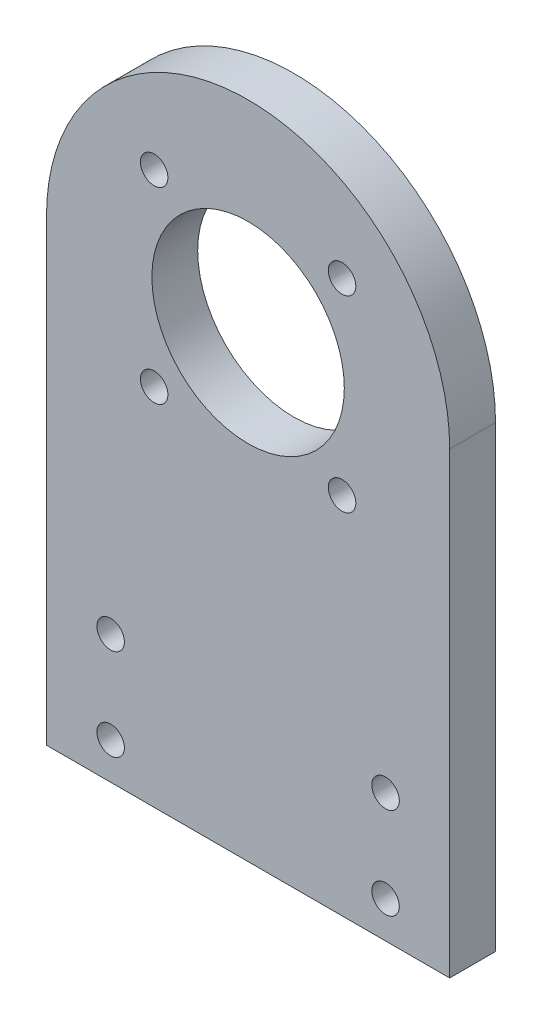
ISO-10303-21;
HEADER;
FILE_DESCRIPTION(('STEP AP214'),'2;1');
FILE_NAME('part.step','',(''),(''),'','','');
FILE_SCHEMA(('AUTOMOTIVE_DESIGN { 1 0 10303 214 1 1 1 1 }'));
ENDSEC;
DATA;
#1=APPLICATION_CONTEXT('core data for automotive mechanical design processes');
#2=APPLICATION_PROTOCOL_DEFINITION('international standard','automotive_design',2000,#1);
#3=PRODUCT_CONTEXT('',#1,'mechanical');
#4=PRODUCT('Part','Part','',(#3));
#5=PRODUCT_RELATED_PRODUCT_CATEGORY('part','',(#4));
#6=PRODUCT_DEFINITION_FORMATION('','',#4);
#7=PRODUCT_DEFINITION_CONTEXT('part definition',#1,'design');
#8=PRODUCT_DEFINITION('design','',#6,#7);
#9=PRODUCT_DEFINITION_SHAPE('','',#8);
#10=(LENGTH_UNIT() NAMED_UNIT(*) SI_UNIT(.MILLI.,.METRE.));
#11=(NAMED_UNIT(*) PLANE_ANGLE_UNIT() SI_UNIT($,.RADIAN.));
#12=(NAMED_UNIT(*) SI_UNIT($,.STERADIAN.) SOLID_ANGLE_UNIT());
#13=UNCERTAINTY_MEASURE_WITH_UNIT(LENGTH_MEASURE(1.E-05),#10,'distance_accuracy_value','');
#14=(GEOMETRIC_REPRESENTATION_CONTEXT(3) GLOBAL_UNCERTAINTY_ASSIGNED_CONTEXT((#13)) GLOBAL_UNIT_ASSIGNED_CONTEXT((#10,
#11,#12)) REPRESENTATION_CONTEXT('',''));
#15=CARTESIAN_POINT('',(0.,0.,0.));
#16=DIRECTION('',(0.,0.,1.));
#17=DIRECTION('',(1.,0.,0.));
#18=AXIS2_PLACEMENT_3D('',#15,#16,#17);
#19=CARTESIAN_POINT('',(1.17961196366423E-13,50.,5.));
#20=DIRECTION('',(0.,0.,1.));
#21=DIRECTION('',(1.,0.,0.));
#22=AXIS2_PLACEMENT_3D('',#19,#20,#21);
#23=PLANE('',#22);
#24=CARTESIAN_POINT('',(-10.2530483272048,39.7469516727951,5.));
#25=DIRECTION('',(0.,0.,-1.));
#26=DIRECTION('',(-1.,0.,0.));
#27=AXIS2_PLACEMENT_3D('',#24,#25,#26);
#28=CIRCLE('',#27,1.5);
#29=CARTESIAN_POINT('',(-11.7530483272048,39.7469516727951,5.));
#30=VERTEX_POINT('',#29);
#31=EDGE_CURVE('E151',#30,#30,#28,.T.);
#32=ORIENTED_EDGE('',*,*,#31,.T.);
#33=EDGE_LOOP('',(#32));
#34=FACE_BOUND('',#33,.T.);
#35=CARTESIAN_POINT('',(10.253048327205,39.7469516727951,5.));
#36=DIRECTION('',(0.,0.,-1.));
#37=DIRECTION('',(-1.,0.,0.));
#38=AXIS2_PLACEMENT_3D('',#35,#36,#37);
#39=CIRCLE('',#38,1.5);
#40=CARTESIAN_POINT('',(8.75304832720504,39.7469516727951,5.));
#41=VERTEX_POINT('',#40);
#42=EDGE_CURVE('E163',#41,#41,#39,.T.);
#43=ORIENTED_EDGE('',*,*,#42,.T.);
#44=EDGE_LOOP('',(#43));
#45=FACE_BOUND('',#44,.T.);
#46=CARTESIAN_POINT('',(10.2530483272051,60.2530483272049,5.));
#47=DIRECTION('',(0.,0.,-1.));
#48=DIRECTION('',(-1.,0.,0.));
#49=AXIS2_PLACEMENT_3D('',#46,#47,#48);
#50=CIRCLE('',#49,1.50000000000001);
#51=CARTESIAN_POINT('',(8.75304832720507,60.2530483272049,5.));
#52=VERTEX_POINT('',#51);
#53=EDGE_CURVE('E157',#52,#52,#50,.T.);
#54=ORIENTED_EDGE('',*,*,#53,.T.);
#55=EDGE_LOOP('',(#54));
#56=FACE_BOUND('',#55,.T.);
#57=CARTESIAN_POINT('',(-10.2530483272048,60.253048327205,5.));
#58=DIRECTION('',(0.,0.,-1.));
#59=DIRECTION('',(-1.,0.,0.));
#60=AXIS2_PLACEMENT_3D('',#57,#58,#59);
#61=CIRCLE('',#60,1.5);
#62=CARTESIAN_POINT('',(-11.7530483272048,60.253048327205,5.));
#63=VERTEX_POINT('',#62);
#64=EDGE_CURVE('E145',#63,#63,#61,.T.);
#65=ORIENTED_EDGE('',*,*,#64,.T.);
#66=EDGE_LOOP('',(#65));
#67=FACE_BOUND('',#66,.T.);
#68=CARTESIAN_POINT('',(15.,14.,5.));
#69=DIRECTION('',(0.,0.,1.));
#70=DIRECTION('',(-1.,0.,0.));
#71=AXIS2_PLACEMENT_3D('',#68,#69,#70);
#72=CIRCLE('',#71,1.5);
#73=CARTESIAN_POINT('',(13.5,14.,5.));
#74=VERTEX_POINT('',#73);
#75=EDGE_CURVE('E133',#74,#74,#72,.T.);
#76=ORIENTED_EDGE('',*,*,#75,.F.);
#77=EDGE_LOOP('',(#76));
#78=FACE_BOUND('',#77,.T.);
#79=CARTESIAN_POINT('',(-15.,4.,5.));
#80=DIRECTION('',(0.,0.,1.));
#81=DIRECTION('',(1.,0.,0.));
#82=AXIS2_PLACEMENT_3D('',#79,#80,#81);
#83=CIRCLE('',#82,1.5);
#84=CARTESIAN_POINT('',(-13.5,4.,5.));
#85=VERTEX_POINT('',#84);
#86=EDGE_CURVE('E121',#85,#85,#83,.T.);
#87=ORIENTED_EDGE('',*,*,#86,.F.);
#88=EDGE_LOOP('',(#87));
#89=FACE_BOUND('',#88,.T.);
#90=DIRECTION('',(0.,-1.,0.));
#91=VECTOR('',#90,1.);
#92=CARTESIAN_POINT('',(-22.,0.,5.));
#93=LINE('',#92,#91);
#94=CARTESIAN_POINT('',(-21.9999999999999,50.,5.));
#95=VERTEX_POINT('',#94);
#96=CARTESIAN_POINT('',(-22.,0.,5.));
#97=VERTEX_POINT('',#96);
#98=EDGE_CURVE('E91',#95,#97,#93,.T.);
#99=ORIENTED_EDGE('',*,*,#98,.T.);
#100=DIRECTION('',(1.,0.,0.));
#101=VECTOR('',#100,1.);
#102=CARTESIAN_POINT('',(-22.,0.,5.));
#103=LINE('',#102,#101);
#104=CARTESIAN_POINT('',(22.,0.,5.));
#105=VERTEX_POINT('',#104);
#106=EDGE_CURVE('E86',#97,#105,#103,.T.);
#107=ORIENTED_EDGE('',*,*,#106,.T.);
#108=DIRECTION('',(0.,1.,0.));
#109=VECTOR('',#108,1.);
#110=CARTESIAN_POINT('',(22.,0.,5.));
#111=LINE('',#110,#109);
#112=CARTESIAN_POINT('',(22.,50.,5.));
#113=VERTEX_POINT('',#112);
#114=EDGE_CURVE('E89',#105,#113,#111,.T.);
#115=ORIENTED_EDGE('',*,*,#114,.T.);
#116=CARTESIAN_POINT('',(1.17961196366423E-13,50.,5.));
#117=DIRECTION('',(0.,0.,1.));
#118=DIRECTION('',(1.,0.,0.));
#119=AXIS2_PLACEMENT_3D('',#116,#117,#118);
#120=CIRCLE('',#119,22.);
#121=EDGE_CURVE('E56',#113,#95,#120,.T.);
#122=ORIENTED_EDGE('',*,*,#121,.T.);
#123=EDGE_LOOP('',(#99,#107,#115,#122));
#124=FACE_BOUND('',#123,.T.);
#125=CARTESIAN_POINT('',(-15.,14.,5.));
#126=DIRECTION('',(0.,0.,1.));
#127=DIRECTION('',(1.,0.,0.));
#128=AXIS2_PLACEMENT_3D('',#125,#126,#127);
#129=CIRCLE('',#128,1.5);
#130=CARTESIAN_POINT('',(-13.5,14.,5.));
#131=VERTEX_POINT('',#130);
#132=EDGE_CURVE('E106',#131,#131,#129,.T.);
#133=ORIENTED_EDGE('',*,*,#132,.F.);
#134=EDGE_LOOP('',(#133));
#135=FACE_BOUND('',#134,.T.);
#136=CARTESIAN_POINT('',(15.,4.,5.));
#137=DIRECTION('',(0.,0.,1.));
#138=DIRECTION('',(-1.,0.,0.));
#139=AXIS2_PLACEMENT_3D('',#136,#137,#138);
#140=CIRCLE('',#139,1.5);
#141=CARTESIAN_POINT('',(13.5,4.,5.));
#142=VERTEX_POINT('',#141);
#143=EDGE_CURVE('E127',#142,#142,#140,.T.);
#144=ORIENTED_EDGE('',*,*,#143,.F.);
#145=EDGE_LOOP('',(#144));
#146=FACE_BOUND('',#145,.T.);
#147=CARTESIAN_POINT('',(1.17961196366423E-13,50.,5.));
#148=DIRECTION('',(0.,0.,1.));
#149=DIRECTION('',(1.,0.,0.));
#150=AXIS2_PLACEMENT_3D('',#147,#148,#149);
#151=CIRCLE('',#150,10.5);
#152=CARTESIAN_POINT('',(10.5000000000001,50.,5.));
#153=VERTEX_POINT('',#152);
#154=EDGE_CURVE('E139',#153,#153,#151,.T.);
#155=ORIENTED_EDGE('',*,*,#154,.F.);
#156=EDGE_LOOP('',(#155));
#157=FACE_BOUND('',#156,.T.);
#158=ADVANCED_FACE('F39',(#34,#45,#56,#67,#78,#89,#124,#135,#146,#157),#23,.T.);
#159=CARTESIAN_POINT('',(1.17961196366423E-13,50.,0.));
#160=DIRECTION('',(0.,0.,1.));
#161=DIRECTION('',(1.,0.,0.));
#162=AXIS2_PLACEMENT_3D('',#159,#160,#161);
#163=PLANE('',#162);
#164=CARTESIAN_POINT('',(-10.2530483272048,39.7469516727951,0.));
#165=DIRECTION('',(0.,0.,-1.));
#166=DIRECTION('',(-1.,0.,0.));
#167=AXIS2_PLACEMENT_3D('',#164,#165,#166);
#168=CIRCLE('',#167,1.5);
#169=CARTESIAN_POINT('',(-11.7530483272048,39.7469516727951,0.));
#170=VERTEX_POINT('',#169);
#171=EDGE_CURVE('E166',#170,#170,#168,.T.);
#172=ORIENTED_EDGE('',*,*,#171,.F.);
#173=EDGE_LOOP('',(#172));
#174=FACE_BOUND('',#173,.T.);
#175=CARTESIAN_POINT('',(10.253048327205,39.7469516727951,0.));
#176=DIRECTION('',(0.,0.,-1.));
#177=DIRECTION('',(-1.,0.,0.));
#178=AXIS2_PLACEMENT_3D('',#175,#176,#177);
#179=CIRCLE('',#178,1.5);
#180=CARTESIAN_POINT('',(8.75304832720504,39.7469516727951,0.));
#181=VERTEX_POINT('',#180);
#182=EDGE_CURVE('E160',#181,#181,#179,.T.);
#183=ORIENTED_EDGE('',*,*,#182,.F.);
#184=EDGE_LOOP('',(#183));
#185=FACE_BOUND('',#184,.T.);
#186=CARTESIAN_POINT('',(10.2530483272051,60.2530483272049,0.));
#187=DIRECTION('',(0.,0.,-1.));
#188=DIRECTION('',(-1.,0.,0.));
#189=AXIS2_PLACEMENT_3D('',#186,#187,#188);
#190=CIRCLE('',#189,1.50000000000001);
#191=CARTESIAN_POINT('',(8.75304832720507,60.2530483272049,0.));
#192=VERTEX_POINT('',#191);
#193=EDGE_CURVE('E154',#192,#192,#190,.T.);
#194=ORIENTED_EDGE('',*,*,#193,.F.);
#195=EDGE_LOOP('',(#194));
#196=FACE_BOUND('',#195,.T.);
#197=CARTESIAN_POINT('',(-10.2530483272048,60.253048327205,0.));
#198=DIRECTION('',(0.,0.,-1.));
#199=DIRECTION('',(-1.,0.,0.));
#200=AXIS2_PLACEMENT_3D('',#197,#198,#199);
#201=CIRCLE('',#200,1.5);
#202=CARTESIAN_POINT('',(-11.7530483272048,60.253048327205,0.));
#203=VERTEX_POINT('',#202);
#204=EDGE_CURVE('E148',#203,#203,#201,.T.);
#205=ORIENTED_EDGE('',*,*,#204,.F.);
#206=EDGE_LOOP('',(#205));
#207=FACE_BOUND('',#206,.T.);
#208=DIRECTION('',(0.,-1.,0.));
#209=VECTOR('',#208,1.);
#210=CARTESIAN_POINT('',(-22.,0.,0.));
#211=LINE('',#210,#209);
#212=CARTESIAN_POINT('',(-21.9999999999999,50.,0.));
#213=VERTEX_POINT('',#212);
#214=CARTESIAN_POINT('',(-22.,0.,0.));
#215=VERTEX_POINT('',#214);
#216=EDGE_CURVE('E103',#213,#215,#211,.T.);
#217=ORIENTED_EDGE('',*,*,#216,.F.);
#218=CARTESIAN_POINT('',(1.17961196366423E-13,50.,0.));
#219=DIRECTION('',(0.,0.,1.));
#220=DIRECTION('',(1.,0.,0.));
#221=AXIS2_PLACEMENT_3D('',#218,#219,#220);
#222=CIRCLE('',#221,22.);
#223=CARTESIAN_POINT('',(22.,50.,0.));
#224=VERTEX_POINT('',#223);
#225=EDGE_CURVE('E79',#224,#213,#222,.T.);
#226=ORIENTED_EDGE('',*,*,#225,.F.);
#227=DIRECTION('',(0.,1.,0.));
#228=VECTOR('',#227,1.);
#229=CARTESIAN_POINT('',(22.,0.,0.));
#230=LINE('',#229,#228);
#231=CARTESIAN_POINT('',(22.,0.,0.));
#232=VERTEX_POINT('',#231);
#233=EDGE_CURVE('E73',#232,#224,#230,.T.);
#234=ORIENTED_EDGE('',*,*,#233,.F.);
#235=DIRECTION('',(1.,0.,0.));
#236=VECTOR('',#235,1.);
#237=CARTESIAN_POINT('',(-22.,0.,0.));
#238=LINE('',#237,#236);
#239=EDGE_CURVE('E95',#215,#232,#238,.T.);
#240=ORIENTED_EDGE('',*,*,#239,.F.);
#241=EDGE_LOOP('',(#217,#226,#234,#240));
#242=FACE_BOUND('',#241,.T.);
#243=CARTESIAN_POINT('',(-15.,14.,0.));
#244=DIRECTION('',(0.,0.,1.));
#245=DIRECTION('',(1.,0.,0.));
#246=AXIS2_PLACEMENT_3D('',#243,#244,#245);
#247=CIRCLE('',#246,1.5);
#248=CARTESIAN_POINT('',(-13.5,14.,0.));
#249=VERTEX_POINT('',#248);
#250=EDGE_CURVE('E118',#249,#249,#247,.T.);
#251=ORIENTED_EDGE('',*,*,#250,.T.);
#252=EDGE_LOOP('',(#251));
#253=FACE_BOUND('',#252,.T.);
#254=CARTESIAN_POINT('',(-15.,4.,0.));
#255=DIRECTION('',(0.,0.,1.));
#256=DIRECTION('',(1.,0.,0.));
#257=AXIS2_PLACEMENT_3D('',#254,#255,#256);
#258=CIRCLE('',#257,1.5);
#259=CARTESIAN_POINT('',(-13.5,4.,0.));
#260=VERTEX_POINT('',#259);
#261=EDGE_CURVE('E124',#260,#260,#258,.T.);
#262=ORIENTED_EDGE('',*,*,#261,.T.);
#263=EDGE_LOOP('',(#262));
#264=FACE_BOUND('',#263,.T.);
#265=CARTESIAN_POINT('',(15.,4.,0.));
#266=DIRECTION('',(0.,0.,1.));
#267=DIRECTION('',(-1.,0.,0.));
#268=AXIS2_PLACEMENT_3D('',#265,#266,#267);
#269=CIRCLE('',#268,1.5);
#270=CARTESIAN_POINT('',(13.5,4.,0.));
#271=VERTEX_POINT('',#270);
#272=EDGE_CURVE('E130',#271,#271,#269,.T.);
#273=ORIENTED_EDGE('',*,*,#272,.T.);
#274=EDGE_LOOP('',(#273));
#275=FACE_BOUND('',#274,.T.);
#276=CARTESIAN_POINT('',(15.,14.,0.));
#277=DIRECTION('',(0.,0.,1.));
#278=DIRECTION('',(-1.,0.,0.));
#279=AXIS2_PLACEMENT_3D('',#276,#277,#278);
#280=CIRCLE('',#279,1.5);
#281=CARTESIAN_POINT('',(13.5,14.,0.));
#282=VERTEX_POINT('',#281);
#283=EDGE_CURVE('E136',#282,#282,#280,.T.);
#284=ORIENTED_EDGE('',*,*,#283,.T.);
#285=EDGE_LOOP('',(#284));
#286=FACE_BOUND('',#285,.T.);
#287=CARTESIAN_POINT('',(1.17961196366423E-13,50.,0.));
#288=DIRECTION('',(0.,0.,1.));
#289=DIRECTION('',(1.,0.,0.));
#290=AXIS2_PLACEMENT_3D('',#287,#288,#289);
#291=CIRCLE('',#290,10.5);
#292=CARTESIAN_POINT('',(10.5000000000001,50.,0.));
#293=VERTEX_POINT('',#292);
#294=EDGE_CURVE('E142',#293,#293,#291,.T.);
#295=ORIENTED_EDGE('',*,*,#294,.T.);
#296=EDGE_LOOP('',(#295));
#297=FACE_BOUND('',#296,.T.);
#298=ADVANCED_FACE('F114',(#174,#185,#196,#207,#242,#253,#264,#275,#286,#297),#163,.F.);
#299=CARTESIAN_POINT('',(-22.,0.,5.));
#300=DIRECTION('',(1.,0.,0.));
#301=DIRECTION('',(0.,0.,-1.));
#302=AXIS2_PLACEMENT_3D('',#299,#300,#301);
#303=PLANE('',#302);
#304=ORIENTED_EDGE('',*,*,#216,.T.);
#305=DIRECTION('',(0.,0.,-1.));
#306=VECTOR('',#305,1.);
#307=CARTESIAN_POINT('',(-22.,0.,5.));
#308=LINE('',#307,#306);
#309=EDGE_CURVE('E11',#97,#215,#308,.T.);
#310=ORIENTED_EDGE('',*,*,#309,.F.);
#311=ORIENTED_EDGE('',*,*,#98,.F.);
#312=DIRECTION('',(0.,0.,-1.));
#313=VECTOR('',#312,1.);
#314=CARTESIAN_POINT('',(-21.9999999999999,50.,5.));
#315=LINE('',#314,#313);
#316=EDGE_CURVE('E99',#95,#213,#315,.T.);
#317=ORIENTED_EDGE('',*,*,#316,.T.);
#318=EDGE_LOOP('',(#304,#310,#311,#317));
#319=FACE_BOUND('',#318,.T.);
#320=ADVANCED_FACE('F41',(#319),#303,.F.);
#321=CARTESIAN_POINT('',(-22.,0.,5.));
#322=DIRECTION('',(0.,1.,0.));
#323=DIRECTION('',(-1.,0.,0.));
#324=AXIS2_PLACEMENT_3D('',#321,#322,#323);
#325=PLANE('',#324);
#326=ORIENTED_EDGE('',*,*,#239,.T.);
#327=DIRECTION('',(0.,0.,-1.));
#328=VECTOR('',#327,1.);
#329=CARTESIAN_POINT('',(22.,0.,5.));
#330=LINE('',#329,#328);
#331=EDGE_CURVE('E48',#105,#232,#330,.T.);
#332=ORIENTED_EDGE('',*,*,#331,.F.);
#333=ORIENTED_EDGE('',*,*,#106,.F.);
#334=ORIENTED_EDGE('',*,*,#309,.T.);
#335=EDGE_LOOP('',(#326,#332,#333,#334));
#336=FACE_BOUND('',#335,.T.);
#337=ADVANCED_FACE('F94',(#336),#325,.F.);
#338=CARTESIAN_POINT('',(22.,0.,5.));
#339=DIRECTION('',(-1.,0.,0.));
#340=DIRECTION('',(0.,-1.,0.));
#341=AXIS2_PLACEMENT_3D('',#338,#339,#340);
#342=PLANE('',#341);
#343=ORIENTED_EDGE('',*,*,#233,.T.);
#344=DIRECTION('',(0.,0.,-1.));
#345=VECTOR('',#344,1.);
#346=CARTESIAN_POINT('',(22.,50.,5.));
#347=LINE('',#346,#345);
#348=EDGE_CURVE('E96',#113,#224,#347,.T.);
#349=ORIENTED_EDGE('',*,*,#348,.F.);
#350=ORIENTED_EDGE('',*,*,#114,.F.);
#351=ORIENTED_EDGE('',*,*,#331,.T.);
#352=EDGE_LOOP('',(#343,#349,#350,#351));
#353=FACE_BOUND('',#352,.T.);
#354=ADVANCED_FACE('F97',(#353),#342,.F.);
#355=CARTESIAN_POINT('',(1.17961196366423E-13,50.,5.));
#356=DIRECTION('',(0.,0.,-1.));
#357=DIRECTION('',(-1.,0.,0.));
#358=AXIS2_PLACEMENT_3D('',#355,#356,#357);
#359=CYLINDRICAL_SURFACE('',#358,22.);
#360=ORIENTED_EDGE('',*,*,#225,.T.);
#361=ORIENTED_EDGE('',*,*,#316,.F.);
#362=ORIENTED_EDGE('',*,*,#121,.F.);
#363=ORIENTED_EDGE('',*,*,#348,.T.);
#364=EDGE_LOOP('',(#360,#361,#362,#363));
#365=FACE_BOUND('',#364,.T.);
#366=ADVANCED_FACE('F111',(#365),#359,.T.);
#367=CARTESIAN_POINT('',(-15.,14.,5.));
#368=DIRECTION('',(0.,0.,-1.));
#369=DIRECTION('',(-1.,0.,0.));
#370=AXIS2_PLACEMENT_3D('',#367,#368,#369);
#371=CYLINDRICAL_SURFACE('',#370,1.5);
#372=ORIENTED_EDGE('',*,*,#132,.T.);
#373=EDGE_LOOP('',(#372));
#374=FACE_BOUND('',#373,.T.);
#375=ORIENTED_EDGE('',*,*,#250,.F.);
#376=EDGE_LOOP('',(#375));
#377=FACE_BOUND('',#376,.T.);
#378=ADVANCED_FACE('F211',(#374,#377),#371,.F.);
#379=CARTESIAN_POINT('',(-15.,4.,5.));
#380=DIRECTION('',(0.,0.,-1.));
#381=DIRECTION('',(-1.,0.,0.));
#382=AXIS2_PLACEMENT_3D('',#379,#380,#381);
#383=CYLINDRICAL_SURFACE('',#382,1.5);
#384=ORIENTED_EDGE('',*,*,#86,.T.);
#385=EDGE_LOOP('',(#384));
#386=FACE_BOUND('',#385,.T.);
#387=ORIENTED_EDGE('',*,*,#261,.F.);
#388=EDGE_LOOP('',(#387));
#389=FACE_BOUND('',#388,.T.);
#390=ADVANCED_FACE('F270',(#386,#389),#383,.F.);
#391=CARTESIAN_POINT('',(15.,4.,5.));
#392=DIRECTION('',(0.,0.,-1.));
#393=DIRECTION('',(-1.,0.,0.));
#394=AXIS2_PLACEMENT_3D('',#391,#392,#393);
#395=CYLINDRICAL_SURFACE('',#394,1.5);
#396=ORIENTED_EDGE('',*,*,#143,.T.);
#397=EDGE_LOOP('',(#396));
#398=FACE_BOUND('',#397,.T.);
#399=ORIENTED_EDGE('',*,*,#272,.F.);
#400=EDGE_LOOP('',(#399));
#401=FACE_BOUND('',#400,.T.);
#402=ADVANCED_FACE('F273',(#398,#401),#395,.F.);
#403=CARTESIAN_POINT('',(15.,14.,5.));
#404=DIRECTION('',(0.,0.,-1.));
#405=DIRECTION('',(-1.,0.,0.));
#406=AXIS2_PLACEMENT_3D('',#403,#404,#405);
#407=CYLINDRICAL_SURFACE('',#406,1.5);
#408=ORIENTED_EDGE('',*,*,#75,.T.);
#409=EDGE_LOOP('',(#408));
#410=FACE_BOUND('',#409,.T.);
#411=ORIENTED_EDGE('',*,*,#283,.F.);
#412=EDGE_LOOP('',(#411));
#413=FACE_BOUND('',#412,.T.);
#414=ADVANCED_FACE('F202',(#410,#413),#407,.F.);
#415=CARTESIAN_POINT('',(1.17961196366423E-13,50.,5.));
#416=DIRECTION('',(0.,0.,-1.));
#417=DIRECTION('',(-1.,0.,0.));
#418=AXIS2_PLACEMENT_3D('',#415,#416,#417);
#419=CYLINDRICAL_SURFACE('',#418,10.5);
#420=ORIENTED_EDGE('',*,*,#154,.T.);
#421=EDGE_LOOP('',(#420));
#422=FACE_BOUND('',#421,.T.);
#423=ORIENTED_EDGE('',*,*,#294,.F.);
#424=EDGE_LOOP('',(#423));
#425=FACE_BOUND('',#424,.T.);
#426=ADVANCED_FACE('F193',(#422,#425),#419,.F.);
#427=CARTESIAN_POINT('',(-10.2530483272048,60.253048327205,5.));
#428=DIRECTION('',(0.,0.,-1.));
#429=DIRECTION('',(-1.,0.,0.));
#430=AXIS2_PLACEMENT_3D('',#427,#428,#429);
#431=CYLINDRICAL_SURFACE('',#430,1.5);
#432=ORIENTED_EDGE('',*,*,#64,.F.);
#433=EDGE_LOOP('',(#432));
#434=FACE_BOUND('',#433,.T.);
#435=ORIENTED_EDGE('',*,*,#204,.T.);
#436=EDGE_LOOP('',(#435));
#437=FACE_BOUND('',#436,.T.);
#438=ADVANCED_FACE('F190',(#434,#437),#431,.F.);
#439=CARTESIAN_POINT('',(10.2530483272051,60.2530483272049,5.));
#440=DIRECTION('',(0.,0.,-1.));
#441=DIRECTION('',(-1.,0.,0.));
#442=AXIS2_PLACEMENT_3D('',#439,#440,#441);
#443=CYLINDRICAL_SURFACE('',#442,1.50000000000001);
#444=ORIENTED_EDGE('',*,*,#53,.F.);
#445=EDGE_LOOP('',(#444));
#446=FACE_BOUND('',#445,.T.);
#447=ORIENTED_EDGE('',*,*,#193,.T.);
#448=EDGE_LOOP('',(#447));
#449=FACE_BOUND('',#448,.T.);
#450=ADVANCED_FACE('F192',(#446,#449),#443,.F.);
#451=CARTESIAN_POINT('',(10.253048327205,39.7469516727951,5.));
#452=DIRECTION('',(0.,0.,-1.));
#453=DIRECTION('',(-1.,0.,0.));
#454=AXIS2_PLACEMENT_3D('',#451,#452,#453);
#455=CYLINDRICAL_SURFACE('',#454,1.5);
#456=ORIENTED_EDGE('',*,*,#42,.F.);
#457=EDGE_LOOP('',(#456));
#458=FACE_BOUND('',#457,.T.);
#459=ORIENTED_EDGE('',*,*,#182,.T.);
#460=EDGE_LOOP('',(#459));
#461=FACE_BOUND('',#460,.T.);
#462=ADVANCED_FACE('F177',(#458,#461),#455,.F.);
#463=CARTESIAN_POINT('',(-10.2530483272048,39.7469516727951,5.));
#464=DIRECTION('',(0.,0.,-1.));
#465=DIRECTION('',(-1.,0.,0.));
#466=AXIS2_PLACEMENT_3D('',#463,#464,#465);
#467=CYLINDRICAL_SURFACE('',#466,1.5);
#468=ORIENTED_EDGE('',*,*,#31,.F.);
#469=EDGE_LOOP('',(#468));
#470=FACE_BOUND('',#469,.T.);
#471=ORIENTED_EDGE('',*,*,#171,.T.);
#472=EDGE_LOOP('',(#471));
#473=FACE_BOUND('',#472,.T.);
#474=ADVANCED_FACE('F174',(#470,#473),#467,.F.);
#475=CLOSED_SHELL('',(#158,#298,#320,#337,#354,#366,#378,#390,#402,#414,#426,#438,#450,#462,#474));
#476=MANIFOLD_SOLID_BREP('B2',#475);
#477=ADVANCED_BREP_SHAPE_REPRESENTATION('',(#18,#476),#14);
#478=SHAPE_DEFINITION_REPRESENTATION(#9,#477);
ENDSEC;
END-ISO-10303-21;
